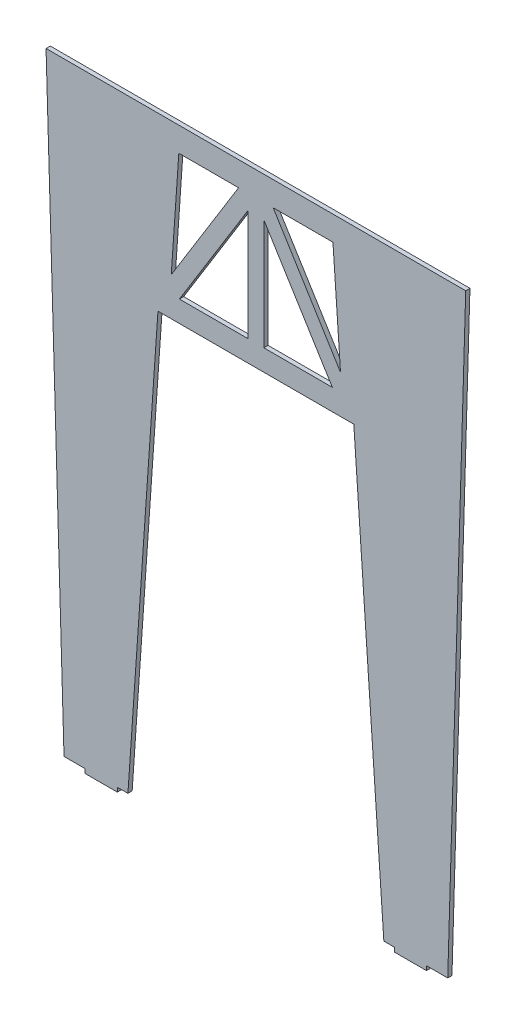
ISO-10303-21;
HEADER;
FILE_DESCRIPTION(('STEP AP214'),'2;1');
FILE_NAME('part.step','',(''),(''),'','','');
FILE_SCHEMA(('AUTOMOTIVE_DESIGN { 1 0 10303 214 1 1 1 1 }'));
ENDSEC;
DATA;
#1=APPLICATION_CONTEXT('core data for automotive mechanical design processes');
#2=APPLICATION_PROTOCOL_DEFINITION('international standard','automotive_design',2000,#1);
#3=PRODUCT_CONTEXT('',#1,'mechanical');
#4=PRODUCT('Part','Part','',(#3));
#5=PRODUCT_RELATED_PRODUCT_CATEGORY('part','',(#4));
#6=PRODUCT_DEFINITION_FORMATION('','',#4);
#7=PRODUCT_DEFINITION_CONTEXT('part definition',#1,'design');
#8=PRODUCT_DEFINITION('design','',#6,#7);
#9=PRODUCT_DEFINITION_SHAPE('','',#8);
#10=(LENGTH_UNIT() NAMED_UNIT(*) SI_UNIT(.MILLI.,.METRE.));
#11=(NAMED_UNIT(*) PLANE_ANGLE_UNIT() SI_UNIT($,.RADIAN.));
#12=(NAMED_UNIT(*) SI_UNIT($,.STERADIAN.) SOLID_ANGLE_UNIT());
#13=UNCERTAINTY_MEASURE_WITH_UNIT(LENGTH_MEASURE(1.E-05),#10,'distance_accuracy_value','');
#14=(GEOMETRIC_REPRESENTATION_CONTEXT(3) GLOBAL_UNCERTAINTY_ASSIGNED_CONTEXT((#13)) GLOBAL_UNIT_ASSIGNED_CONTEXT((#10,
#11,#12)) REPRESENTATION_CONTEXT('',''));
#15=CARTESIAN_POINT('',(0.,0.,0.));
#16=DIRECTION('',(0.,0.,1.));
#17=DIRECTION('',(1.,0.,0.));
#18=AXIS2_PLACEMENT_3D('',#15,#16,#17);
#19=CARTESIAN_POINT('',(626.751403761494,387.432839497839,10.16));
#20=DIRECTION('',(-0.850602753598735,-0.52580885839842,0.));
#21=DIRECTION('',(0.52580885839842,-0.850602753598735,0.));
#22=AXIS2_PLACEMENT_3D('',#19,#20,#21);
#23=PLANE('',#22);
#24=DIRECTION('',(-0.52580885839842,0.850602753598735,0.));
#25=VECTOR('',#24,1.);
#26=CARTESIAN_POINT('',(626.751403761494,387.432839497839,0.));
#27=LINE('',#26,#25);
#28=CARTESIAN_POINT('',(183.241684323222,1104.9,0.));
#29=VERTEX_POINT('',#28);
#30=CARTESIAN_POINT('',(19.05,1370.5134383676,0.));
#31=VERTEX_POINT('',#30);
#32=EDGE_CURVE('E230',#29,#31,#27,.T.);
#33=ORIENTED_EDGE('',*,*,#32,.F.);
#34=DIRECTION('',(0.,0.,-1.));
#35=VECTOR('',#34,1.);
#36=CARTESIAN_POINT('',(183.241684323222,1104.9,10.16));
#37=LINE('',#36,#35);
#38=CARTESIAN_POINT('',(183.241684323222,1104.9,10.16));
#39=VERTEX_POINT('',#38);
#40=EDGE_CURVE('E11',#39,#29,#37,.T.);
#41=ORIENTED_EDGE('',*,*,#40,.F.);
#42=DIRECTION('',(-0.52580885839842,0.850602753598735,0.));
#43=VECTOR('',#42,1.);
#44=CARTESIAN_POINT('',(626.751403761494,387.432839497839,10.16));
#45=LINE('',#44,#43);
#46=CARTESIAN_POINT('',(19.05,1370.5134383676,10.16));
#47=VERTEX_POINT('',#46);
#48=EDGE_CURVE('E228',#39,#47,#45,.T.);
#49=ORIENTED_EDGE('',*,*,#48,.T.);
#50=DIRECTION('',(0.,0.,-1.));
#51=VECTOR('',#50,1.);
#52=CARTESIAN_POINT('',(19.05,1370.5134383676,10.16));
#53=LINE('',#52,#51);
#54=EDGE_CURVE('E58',#47,#31,#53,.T.);
#55=ORIENTED_EDGE('',*,*,#54,.T.);
#56=EDGE_LOOP('',(#33,#41,#49,#55));
#57=FACE_BOUND('',#56,.T.);
#58=ADVANCED_FACE('F39',(#57),#23,.T.);
#59=CARTESIAN_POINT('',(7.88917784116219E-12,1104.9,10.16));
#60=DIRECTION('',(0.,1.,0.));
#61=DIRECTION('',(-1.,0.,0.));
#62=AXIS2_PLACEMENT_3D('',#59,#60,#61);
#63=PLANE('',#62);
#64=DIRECTION('',(1.,0.,0.));
#65=VECTOR('',#64,1.);
#66=CARTESIAN_POINT('',(7.88917784116219E-12,1104.9,0.));
#67=LINE('',#66,#65);
#68=CARTESIAN_POINT('',(19.0500000000007,1104.9,0.));
#69=VERTEX_POINT('',#68);
#70=EDGE_CURVE('E321',#69,#29,#67,.T.);
#71=ORIENTED_EDGE('',*,*,#70,.F.);
#72=DIRECTION('',(0.,0.,-1.));
#73=VECTOR('',#72,1.);
#74=CARTESIAN_POINT('',(19.0500000000007,1104.9,10.16));
#75=LINE('',#74,#73);
#76=CARTESIAN_POINT('',(19.0500000000007,1104.9,10.16));
#77=VERTEX_POINT('',#76);
#78=EDGE_CURVE('E49',#77,#69,#75,.T.);
#79=ORIENTED_EDGE('',*,*,#78,.F.);
#80=DIRECTION('',(1.,0.,0.));
#81=VECTOR('',#80,1.);
#82=CARTESIAN_POINT('',(7.88917784116219E-12,1104.9,10.16));
#83=LINE('',#82,#81);
#84=EDGE_CURVE('E237',#77,#39,#83,.T.);
#85=ORIENTED_EDGE('',*,*,#84,.T.);
#86=ORIENTED_EDGE('',*,*,#40,.T.);
#87=EDGE_LOOP('',(#71,#79,#85,#86));
#88=FACE_BOUND('',#87,.T.);
#89=ADVANCED_FACE('F241',(#88),#63,.T.);
#90=CARTESIAN_POINT('',(-306.363703468345,21.2790705516332,10.16));
#91=DIRECTION('',(0.997596562719211,-0.0692899563487692,0.));
#92=DIRECTION('',(0.0692899563487692,0.997596562719212,0.));
#93=AXIS2_PLACEMENT_3D('',#90,#91,#92);
#94=PLANE('',#93);
#95=DIRECTION('',(-0.0692899563487692,-0.997596562719211,0.));
#96=VECTOR('',#95,1.);
#97=CARTESIAN_POINT('',(-306.363703468345,21.2790705516332,0.));
#98=LINE('',#97,#96);
#99=CARTESIAN_POINT('',(-234.62717209688,1054.1,0.));
#100=VERTEX_POINT('',#99);
#101=CARTESIAN_POINT('',(-306.627827519024,17.4763658167283,0.));
#102=VERTEX_POINT('',#101);
#103=EDGE_CURVE('E272',#100,#102,#98,.T.);
#104=ORIENTED_EDGE('',*,*,#103,.F.);
#105=DIRECTION('',(0.,0.,-1.));
#106=VECTOR('',#105,1.);
#107=CARTESIAN_POINT('',(-234.62717209688,1054.1,10.16));
#108=LINE('',#107,#106);
#109=CARTESIAN_POINT('',(-234.62717209688,1054.1,10.16));
#110=VERTEX_POINT('',#109);
#111=EDGE_CURVE('E328',#110,#100,#108,.T.);
#112=ORIENTED_EDGE('',*,*,#111,.F.);
#113=DIRECTION('',(-0.0692899563487692,-0.997596562719211,0.));
#114=VECTOR('',#113,1.);
#115=CARTESIAN_POINT('',(-306.363703468345,21.2790705516332,10.16));
#116=LINE('',#115,#114);
#117=CARTESIAN_POINT('',(-306.627827519024,17.4763658167283,10.16));
#118=VERTEX_POINT('',#117);
#119=EDGE_CURVE('E415',#110,#118,#116,.T.);
#120=ORIENTED_EDGE('',*,*,#119,.T.);
#121=DIRECTION('',(0.,0.,-1.));
#122=VECTOR('',#121,1.);
#123=CARTESIAN_POINT('',(-306.627827519024,17.4763658167283,10.16));
#124=LINE('',#123,#122);
#125=EDGE_CURVE('E330',#118,#102,#124,.T.);
#126=ORIENTED_EDGE('',*,*,#125,.T.);
#127=EDGE_LOOP('',(#104,#112,#120,#126));
#128=FACE_BOUND('',#127,.T.);
#129=ADVANCED_FACE('F467',(#128),#94,.T.);
#130=CARTESIAN_POINT('',(-9.97570809721988E-13,1054.1,10.16));
#131=DIRECTION('',(0.,-1.,0.));
#132=DIRECTION('',(1.,0.,0.));
#133=AXIS2_PLACEMENT_3D('',#130,#131,#132);
#134=PLANE('',#133);
#135=DIRECTION('',(-1.,0.,0.));
#136=VECTOR('',#135,1.);
#137=CARTESIAN_POINT('',(-9.97570809721988E-13,1054.1,0.));
#138=LINE('',#137,#136);
#139=CARTESIAN_POINT('',(234.627172096901,1054.1,0.));
#140=VERTEX_POINT('',#139);
#141=EDGE_CURVE('E275',#140,#100,#138,.T.);
#142=ORIENTED_EDGE('',*,*,#141,.F.);
#143=DIRECTION('',(0.,0.,-1.));
#144=VECTOR('',#143,1.);
#145=CARTESIAN_POINT('',(234.627172096901,1054.1,10.16));
#146=LINE('',#145,#144);
#147=CARTESIAN_POINT('',(234.627172096901,1054.1,10.16));
#148=VERTEX_POINT('',#147);
#149=EDGE_CURVE('E361',#148,#140,#146,.T.);
#150=ORIENTED_EDGE('',*,*,#149,.F.);
#151=DIRECTION('',(-1.,0.,0.));
#152=VECTOR('',#151,1.);
#153=CARTESIAN_POINT('',(-9.97570809721988E-13,1054.1,10.16));
#154=LINE('',#153,#152);
#155=EDGE_CURVE('E418',#148,#110,#154,.T.);
#156=ORIENTED_EDGE('',*,*,#155,.T.);
#157=ORIENTED_EDGE('',*,*,#111,.T.);
#158=EDGE_LOOP('',(#142,#150,#156,#157));
#159=FACE_BOUND('',#158,.T.);
#160=ADVANCED_FACE('F470',(#159),#134,.T.);
#161=CARTESIAN_POINT('',(306.363703468387,21.2790705516425,10.16));
#162=DIRECTION('',(-0.99759656271921,-0.0692899563487899,0.));
#163=DIRECTION('',(0.0692899563487899,-0.99759656271921,0.));
#164=AXIS2_PLACEMENT_3D('',#161,#162,#163);
#165=PLANE('',#164);
#166=DIRECTION('',(-0.0692899563487899,0.99759656271921,0.));
#167=VECTOR('',#166,1.);
#168=CARTESIAN_POINT('',(306.363703468387,21.2790705516425,0.));
#169=LINE('',#168,#167);
#170=CARTESIAN_POINT('',(306.627827519066,17.476365816735,0.));
#171=VERTEX_POINT('',#170);
#172=EDGE_CURVE('E278',#171,#140,#169,.T.);
#173=ORIENTED_EDGE('',*,*,#172,.F.);
#174=DIRECTION('',(0.,0.,-1.));
#175=VECTOR('',#174,1.);
#176=CARTESIAN_POINT('',(306.627827519066,17.476365816735,10.16));
#177=LINE('',#176,#175);
#178=CARTESIAN_POINT('',(306.627827519066,17.476365816735,10.16));
#179=VERTEX_POINT('',#178);
#180=EDGE_CURVE('E359',#179,#171,#177,.T.);
#181=ORIENTED_EDGE('',*,*,#180,.F.);
#182=DIRECTION('',(-0.0692899563487899,0.99759656271921,0.));
#183=VECTOR('',#182,1.);
#184=CARTESIAN_POINT('',(306.363703468387,21.2790705516425,10.16));
#185=LINE('',#184,#183);
#186=EDGE_CURVE('E421',#179,#148,#185,.T.);
#187=ORIENTED_EDGE('',*,*,#186,.T.);
#188=ORIENTED_EDGE('',*,*,#149,.T.);
#189=EDGE_LOOP('',(#173,#181,#187,#188));
#190=FACE_BOUND('',#189,.T.);
#191=ADVANCED_FACE('F475',(#190),#165,.T.);
#192=CARTESIAN_POINT('',(2.67684877527776E-12,17.4763658167819,10.16));
#193=DIRECTION('',(-1.5316964655817E-13,-1.,0.));
#194=DIRECTION('',(1.,-1.5316964655817E-13,0.));
#195=AXIS2_PLACEMENT_3D('',#192,#193,#194);
#196=PLANE('',#195);
#197=DIRECTION('',(-1.,1.5316964655817E-13,0.));
#198=VECTOR('',#197,1.);
#199=CARTESIAN_POINT('',(2.67684877527776E-12,17.4763658167819,0.));
#200=LINE('',#199,#198);
#201=CARTESIAN_POINT('',(332.721789204436,17.476365816731,0.));
#202=VERTEX_POINT('',#201);
#203=EDGE_CURVE('E281',#202,#171,#200,.T.);
#204=ORIENTED_EDGE('',*,*,#203,.F.);
#205=DIRECTION('',(0.,0.,-1.));
#206=VECTOR('',#205,1.);
#207=CARTESIAN_POINT('',(332.721789204436,17.476365816731,10.16));
#208=LINE('',#207,#206);
#209=CARTESIAN_POINT('',(332.721789204436,17.476365816731,10.16));
#210=VERTEX_POINT('',#209);
#211=EDGE_CURVE('E357',#210,#202,#208,.T.);
#212=ORIENTED_EDGE('',*,*,#211,.F.);
#213=DIRECTION('',(-1.,1.5316964655817E-13,0.));
#214=VECTOR('',#213,1.);
#215=CARTESIAN_POINT('',(2.67684877527776E-12,17.4763658167819,10.16));
#216=LINE('',#215,#214);
#217=EDGE_CURVE('E424',#210,#179,#216,.T.);
#218=ORIENTED_EDGE('',*,*,#217,.T.);
#219=ORIENTED_EDGE('',*,*,#180,.T.);
#220=EDGE_LOOP('',(#204,#212,#218,#219));
#221=FACE_BOUND('',#220,.T.);
#222=ADVANCED_FACE('F478',(#221),#196,.T.);
#223=CARTESIAN_POINT('',(332.721789204437,5.45367211371917E-12,10.16));
#224=DIRECTION('',(1.,0.,0.));
#225=DIRECTION('',(0.,1.,0.));
#226=AXIS2_PLACEMENT_3D('',#223,#224,#225);
#227=PLANE('',#226);
#228=DIRECTION('',(0.,-1.,0.));
#229=VECTOR('',#228,1.);
#230=CARTESIAN_POINT('',(332.721789204437,5.45367211371917E-12,0.));
#231=LINE('',#230,#229);
#232=CARTESIAN_POINT('',(332.721789204437,7.31636581673101,0.));
#233=VERTEX_POINT('',#232);
#234=EDGE_CURVE('E284',#202,#233,#231,.T.);
#235=ORIENTED_EDGE('',*,*,#234,.T.);
#236=DIRECTION('',(0.,0.,-1.));
#237=VECTOR('',#236,1.);
#238=CARTESIAN_POINT('',(332.721789204437,7.31636581673101,10.16));
#239=LINE('',#238,#237);
#240=CARTESIAN_POINT('',(332.721789204437,7.31636581673101,10.16));
#241=VERTEX_POINT('',#240);
#242=EDGE_CURVE('E355',#241,#233,#239,.T.);
#243=ORIENTED_EDGE('',*,*,#242,.F.);
#244=DIRECTION('',(0.,-1.,0.));
#245=VECTOR('',#244,1.);
#246=CARTESIAN_POINT('',(332.721789204437,5.45367211371917E-12,10.16));
#247=LINE('',#246,#245);
#248=EDGE_CURVE('E427',#210,#241,#247,.T.);
#249=ORIENTED_EDGE('',*,*,#248,.F.);
#250=ORIENTED_EDGE('',*,*,#211,.T.);
#251=EDGE_LOOP('',(#235,#243,#249,#250));
#252=FACE_BOUND('',#251,.T.);
#253=ADVANCED_FACE('F484',(#252),#227,.F.);
#254=CARTESIAN_POINT('',(0.,7.31636581672713,10.16));
#255=DIRECTION('',(0.,-1.,0.));
#256=DIRECTION('',(1.,0.,0.));
#257=AXIS2_PLACEMENT_3D('',#254,#255,#256);
#258=PLANE('',#257);
#259=DIRECTION('',(-1.,0.,0.));
#260=VECTOR('',#259,1.);
#261=CARTESIAN_POINT('',(0.,7.31636581672713,0.));
#262=LINE('',#261,#260);
#263=CARTESIAN_POINT('',(408.921789204437,7.3163658167319,0.));
#264=VERTEX_POINT('',#263);
#265=EDGE_CURVE('E287',#264,#233,#262,.T.);
#266=ORIENTED_EDGE('',*,*,#265,.F.);
#267=DIRECTION('',(0.,0.,-1.));
#268=VECTOR('',#267,1.);
#269=CARTESIAN_POINT('',(408.921789204437,7.3163658167319,10.16));
#270=LINE('',#269,#268);
#271=CARTESIAN_POINT('',(408.921789204437,7.3163658167319,10.16));
#272=VERTEX_POINT('',#271);
#273=EDGE_CURVE('E353',#272,#264,#270,.T.);
#274=ORIENTED_EDGE('',*,*,#273,.F.);
#275=DIRECTION('',(-1.,0.,0.));
#276=VECTOR('',#275,1.);
#277=CARTESIAN_POINT('',(0.,7.31636581672713,10.16));
#278=LINE('',#277,#276);
#279=EDGE_CURVE('E429',#272,#241,#278,.T.);
#280=ORIENTED_EDGE('',*,*,#279,.T.);
#281=ORIENTED_EDGE('',*,*,#242,.T.);
#282=EDGE_LOOP('',(#266,#274,#280,#281));
#283=FACE_BOUND('',#282,.T.);
#284=ADVANCED_FACE('F488',(#283),#258,.T.);
#285=CARTESIAN_POINT('',(408.921789204437,6.70267301642248E-12,10.16));
#286=DIRECTION('',(1.,0.,0.));
#287=DIRECTION('',(0.,1.,0.));
#288=AXIS2_PLACEMENT_3D('',#285,#286,#287);
#289=PLANE('',#288);
#290=DIRECTION('',(0.,-1.,0.));
#291=VECTOR('',#290,1.);
#292=CARTESIAN_POINT('',(408.921789204437,6.70267301642248E-12,0.));
#293=LINE('',#292,#291);
#294=CARTESIAN_POINT('',(408.921789204436,17.4763658167318,0.));
#295=VERTEX_POINT('',#294);
#296=EDGE_CURVE('E290',#295,#264,#293,.T.);
#297=ORIENTED_EDGE('',*,*,#296,.F.);
#298=DIRECTION('',(0.,0.,-1.));
#299=VECTOR('',#298,1.);
#300=CARTESIAN_POINT('',(408.921789204436,17.4763658167318,10.16));
#301=LINE('',#300,#299);
#302=CARTESIAN_POINT('',(408.921789204436,17.4763658167318,10.16));
#303=VERTEX_POINT('',#302);
#304=EDGE_CURVE('E351',#303,#295,#301,.T.);
#305=ORIENTED_EDGE('',*,*,#304,.F.);
#306=DIRECTION('',(0.,-1.,0.));
#307=VECTOR('',#306,1.);
#308=CARTESIAN_POINT('',(408.921789204437,6.70267301642248E-12,10.16));
#309=LINE('',#308,#307);
#310=EDGE_CURVE('E432',#303,#272,#309,.T.);
#311=ORIENTED_EDGE('',*,*,#310,.T.);
#312=ORIENTED_EDGE('',*,*,#273,.T.);
#313=EDGE_LOOP('',(#297,#305,#311,#312));
#314=FACE_BOUND('',#313,.T.);
#315=ADVANCED_FACE('F491',(#314),#289,.T.);
#316=CARTESIAN_POINT('',(-3.05553759314949E-13,17.4763658167247,10.16));
#317=DIRECTION('',(0.,-1.,0.));
#318=DIRECTION('',(1.,0.,0.));
#319=AXIS2_PLACEMENT_3D('',#316,#317,#318);
#320=PLANE('',#319);
#321=DIRECTION('',(-1.,0.,0.));
#322=VECTOR('',#321,1.);
#323=CARTESIAN_POINT('',(-3.05553759314949E-13,17.4763658167247,0.));
#324=LINE('',#323,#322);
#325=CARTESIAN_POINT('',(459.721789204438,17.4763658167327,0.));
#326=VERTEX_POINT('',#325);
#327=EDGE_CURVE('E293',#326,#295,#324,.T.);
#328=ORIENTED_EDGE('',*,*,#327,.F.);
#329=DIRECTION('',(0.,0.,-1.));
#330=VECTOR('',#329,1.);
#331=CARTESIAN_POINT('',(459.721789204438,17.4763658167327,10.16));
#332=LINE('',#331,#330);
#333=CARTESIAN_POINT('',(459.721789204438,17.4763658167327,10.16));
#334=VERTEX_POINT('',#333);
#335=EDGE_CURVE('E349',#334,#326,#332,.T.);
#336=ORIENTED_EDGE('',*,*,#335,.F.);
#337=DIRECTION('',(-1.,0.,0.));
#338=VECTOR('',#337,1.);
#339=CARTESIAN_POINT('',(-3.05553759314949E-13,17.4763658167247,10.16));
#340=LINE('',#339,#338);
#341=EDGE_CURVE('E435',#334,#303,#340,.T.);
#342=ORIENTED_EDGE('',*,*,#341,.T.);
#343=ORIENTED_EDGE('',*,*,#304,.T.);
#344=EDGE_LOOP('',(#328,#336,#342,#343));
#345=FACE_BOUND('',#344,.T.);
#346=ADVANCED_FACE('F495',(#345),#320,.T.);
#347=CARTESIAN_POINT('',(458.796027329948,-13.6468949518883,10.16));
#348=DIRECTION('',(-0.999557910363731,0.0297318655535194,0.));
#349=DIRECTION('',(-0.0297318655535194,-0.999557910363731,0.));
#350=AXIS2_PLACEMENT_3D('',#347,#348,#349);
#351=PLANE('',#350);
#352=DIRECTION('',(0.0297318655535194,0.999557910363731,0.));
#353=VECTOR('',#352,1.);
#354=CARTESIAN_POINT('',(458.796027329948,-13.6468949518883,0.));
#355=LINE('',#354,#353);
#356=CARTESIAN_POINT('',(502.783260532715,1465.16333388139,0.));
#357=VERTEX_POINT('',#356);
#358=EDGE_CURVE('E296',#326,#357,#355,.T.);
#359=ORIENTED_EDGE('',*,*,#358,.T.);
#360=DIRECTION('',(0.,0.,-1.));
#361=VECTOR('',#360,1.);
#362=CARTESIAN_POINT('',(502.783260532715,1465.16333388139,10.16));
#363=LINE('',#362,#361);
#364=CARTESIAN_POINT('',(502.783260532715,1465.16333388139,10.16));
#365=VERTEX_POINT('',#364);
#366=EDGE_CURVE('E346',#365,#357,#363,.T.);
#367=ORIENTED_EDGE('',*,*,#366,.F.);
#368=DIRECTION('',(0.0297318655535194,0.999557910363731,0.));
#369=VECTOR('',#368,1.);
#370=CARTESIAN_POINT('',(458.796027329948,-13.6468949518883,10.16));
#371=LINE('',#370,#369);
#372=EDGE_CURVE('E438',#334,#365,#371,.T.);
#373=ORIENTED_EDGE('',*,*,#372,.F.);
#374=ORIENTED_EDGE('',*,*,#335,.T.);
#375=EDGE_LOOP('',(#359,#367,#373,#374));
#376=FACE_BOUND('',#375,.T.);
#377=ADVANCED_FACE('F500',(#376),#351,.F.);
#378=CARTESIAN_POINT('',(0.,1465.16333388139,10.16));
#379=DIRECTION('',(0.,-1.,0.));
#380=DIRECTION('',(0.,0.,-1.));
#381=AXIS2_PLACEMENT_3D('',#378,#379,#380);
#382=PLANE('',#381);
#383=DIRECTION('',(-1.,0.,0.));
#384=VECTOR('',#383,1.);
#385=CARTESIAN_POINT('',(0.,1465.16333388139,0.));
#386=LINE('',#385,#384);
#387=CARTESIAN_POINT('',(-502.783260532698,1465.16333388139,0.));
#388=VERTEX_POINT('',#387);
#389=EDGE_CURVE('E299',#357,#388,#386,.T.);
#390=ORIENTED_EDGE('',*,*,#389,.T.);
#391=DIRECTION('',(0.,0.,-1.));
#392=VECTOR('',#391,1.);
#393=CARTESIAN_POINT('',(-502.783260532698,1465.16333388139,10.16));
#394=LINE('',#393,#392);
#395=CARTESIAN_POINT('',(-502.783260532698,1465.16333388139,10.16));
#396=VERTEX_POINT('',#395);
#397=EDGE_CURVE('E344',#396,#388,#394,.T.);
#398=ORIENTED_EDGE('',*,*,#397,.F.);
#399=DIRECTION('',(-1.,0.,0.));
#400=VECTOR('',#399,1.);
#401=CARTESIAN_POINT('',(0.,1465.16333388139,10.16));
#402=LINE('',#401,#400);
#403=EDGE_CURVE('E441',#365,#396,#402,.T.);
#404=ORIENTED_EDGE('',*,*,#403,.F.);
#405=ORIENTED_EDGE('',*,*,#366,.T.);
#406=EDGE_LOOP('',(#390,#398,#404,#405));
#407=FACE_BOUND('',#406,.T.);
#408=ADVANCED_FACE('F505',(#407),#382,.F.);
#409=CARTESIAN_POINT('',(-458.796027329871,-13.6468949519044,10.16));
#410=DIRECTION('',(-0.999557910363729,-0.0297318655535594,0.));
#411=DIRECTION('',(0.0297318655535594,-0.999557910363729,0.));
#412=AXIS2_PLACEMENT_3D('',#409,#410,#411);
#413=PLANE('',#412);
#414=DIRECTION('',(-0.0297318655535594,0.999557910363729,0.));
#415=VECTOR('',#414,1.);
#416=CARTESIAN_POINT('',(-458.796027329871,-13.6468949519044,0.));
#417=LINE('',#416,#415);
#418=CARTESIAN_POINT('',(-459.721789204362,17.4763658167194,0.));
#419=VERTEX_POINT('',#418);
#420=EDGE_CURVE('E302',#419,#388,#417,.T.);
#421=ORIENTED_EDGE('',*,*,#420,.F.);
#422=DIRECTION('',(0.,0.,-1.));
#423=VECTOR('',#422,1.);
#424=CARTESIAN_POINT('',(-459.721789204362,17.4763658167194,10.16));
#425=LINE('',#424,#423);
#426=CARTESIAN_POINT('',(-459.721789204362,17.4763658167194,10.16));
#427=VERTEX_POINT('',#426);
#428=EDGE_CURVE('E342',#427,#419,#425,.T.);
#429=ORIENTED_EDGE('',*,*,#428,.F.);
#430=DIRECTION('',(-0.0297318655535594,0.999557910363729,0.));
#431=VECTOR('',#430,1.);
#432=CARTESIAN_POINT('',(-458.796027329871,-13.6468949519044,10.16));
#433=LINE('',#432,#431);
#434=EDGE_CURVE('E443',#427,#396,#433,.T.);
#435=ORIENTED_EDGE('',*,*,#434,.T.);
#436=ORIENTED_EDGE('',*,*,#397,.T.);
#437=EDGE_LOOP('',(#421,#429,#435,#436));
#438=FACE_BOUND('',#437,.T.);
#439=ADVANCED_FACE('F508',(#438),#413,.T.);
#440=CARTESIAN_POINT('',(-3.05553759315014E-13,17.4763658167274,10.16));
#441=DIRECTION('',(0.,-1.,0.));
#442=DIRECTION('',(1.,0.,0.));
#443=AXIS2_PLACEMENT_3D('',#440,#441,#442);
#444=PLANE('',#443);
#445=DIRECTION('',(-1.,0.,0.));
#446=VECTOR('',#445,1.);
#447=CARTESIAN_POINT('',(-3.05553759315014E-13,17.4763658167274,0.));
#448=LINE('',#447,#446);
#449=CARTESIAN_POINT('',(-408.921789204363,17.4763658167203,0.));
#450=VERTEX_POINT('',#449);
#451=EDGE_CURVE('E305',#450,#419,#448,.T.);
#452=ORIENTED_EDGE('',*,*,#451,.F.);
#453=DIRECTION('',(0.,0.,-1.));
#454=VECTOR('',#453,1.);
#455=CARTESIAN_POINT('',(-408.921789204363,17.4763658167203,10.16));
#456=LINE('',#455,#454);
#457=CARTESIAN_POINT('',(-408.921789204363,17.4763658167203,10.16));
#458=VERTEX_POINT('',#457);
#459=EDGE_CURVE('E340',#458,#450,#456,.T.);
#460=ORIENTED_EDGE('',*,*,#459,.F.);
#461=DIRECTION('',(-1.,0.,0.));
#462=VECTOR('',#461,1.);
#463=CARTESIAN_POINT('',(-3.05553759315014E-13,17.4763658167274,10.16));
#464=LINE('',#463,#462);
#465=EDGE_CURVE('E446',#458,#427,#464,.T.);
#466=ORIENTED_EDGE('',*,*,#465,.T.);
#467=ORIENTED_EDGE('',*,*,#428,.T.);
#468=EDGE_LOOP('',(#452,#460,#466,#467));
#469=FACE_BOUND('',#468,.T.);
#470=ADVANCED_FACE('F511',(#469),#444,.T.);
#471=CARTESIAN_POINT('',(-408.921789204363,-6.70267301642128E-12,10.16));
#472=DIRECTION('',(1.,0.,0.));
#473=DIRECTION('',(0.,1.,0.));
#474=AXIS2_PLACEMENT_3D('',#471,#472,#473);
#475=PLANE('',#474);
#476=DIRECTION('',(0.,-1.,0.));
#477=VECTOR('',#476,1.);
#478=CARTESIAN_POINT('',(-408.921789204363,-6.70267301642128E-12,0.));
#479=LINE('',#478,#477);
#480=CARTESIAN_POINT('',(-408.921789204363,7.31636581672035,0.));
#481=VERTEX_POINT('',#480);
#482=EDGE_CURVE('E308',#450,#481,#479,.T.);
#483=ORIENTED_EDGE('',*,*,#482,.T.);
#484=DIRECTION('',(0.,0.,-1.));
#485=VECTOR('',#484,1.);
#486=CARTESIAN_POINT('',(-408.921789204363,7.31636581672035,10.16));
#487=LINE('',#486,#485);
#488=CARTESIAN_POINT('',(-408.921789204363,7.31636581672035,10.16));
#489=VERTEX_POINT('',#488);
#490=EDGE_CURVE('E337',#489,#481,#487,.T.);
#491=ORIENTED_EDGE('',*,*,#490,.F.);
#492=DIRECTION('',(0.,-1.,0.));
#493=VECTOR('',#492,1.);
#494=CARTESIAN_POINT('',(-408.921789204363,-6.70267301642128E-12,10.16));
#495=LINE('',#494,#493);
#496=EDGE_CURVE('E449',#458,#489,#495,.T.);
#497=ORIENTED_EDGE('',*,*,#496,.F.);
#498=ORIENTED_EDGE('',*,*,#459,.T.);
#499=EDGE_LOOP('',(#483,#491,#497,#498));
#500=FACE_BOUND('',#499,.T.);
#501=ADVANCED_FACE('F516',(#500),#475,.F.);
#502=CARTESIAN_POINT('',(0.,7.31636581672508,10.16));
#503=DIRECTION('',(0.,1.,0.));
#504=DIRECTION('',(-1.,0.,0.));
#505=AXIS2_PLACEMENT_3D('',#502,#503,#504);
#506=PLANE('',#505);
#507=DIRECTION('',(1.,0.,0.));
#508=VECTOR('',#507,1.);
#509=CARTESIAN_POINT('',(0.,7.31636581672508,0.));
#510=LINE('',#509,#508);
#511=CARTESIAN_POINT('',(-332.100796745169,7.31636581672124,0.));
#512=VERTEX_POINT('',#511);
#513=EDGE_CURVE('E311',#481,#512,#510,.T.);
#514=ORIENTED_EDGE('',*,*,#513,.T.);
#515=DIRECTION('',(0.,0.,-1.));
#516=VECTOR('',#515,1.);
#517=CARTESIAN_POINT('',(-332.100796745169,7.31636581672124,10.16));
#518=LINE('',#517,#516);
#519=CARTESIAN_POINT('',(-332.100796745169,7.31636581672124,10.16));
#520=VERTEX_POINT('',#519);
#521=EDGE_CURVE('E335',#520,#512,#518,.T.);
#522=ORIENTED_EDGE('',*,*,#521,.F.);
#523=DIRECTION('',(1.,0.,0.));
#524=VECTOR('',#523,1.);
#525=CARTESIAN_POINT('',(0.,7.31636581672508,10.16));
#526=LINE('',#525,#524);
#527=EDGE_CURVE('E452',#489,#520,#526,.T.);
#528=ORIENTED_EDGE('',*,*,#527,.F.);
#529=ORIENTED_EDGE('',*,*,#490,.T.);
#530=EDGE_LOOP('',(#514,#522,#528,#529));
#531=FACE_BOUND('',#530,.T.);
#532=ADVANCED_FACE('F519',(#531),#506,.F.);
#533=CARTESIAN_POINT('',(-332.100796745169,-5.44349337169559E-12,10.16));
#534=DIRECTION('',(1.,0.,0.));
#535=DIRECTION('',(0.,1.,0.));
#536=AXIS2_PLACEMENT_3D('',#533,#534,#535);
#537=PLANE('',#536);
#538=DIRECTION('',(0.,-1.,0.));
#539=VECTOR('',#538,1.);
#540=CARTESIAN_POINT('',(-332.100796745169,-5.44349337169559E-12,0.));
#541=LINE('',#540,#539);
#542=CARTESIAN_POINT('',(-332.100796745169,17.4763658167212,0.));
#543=VERTEX_POINT('',#542);
#544=EDGE_CURVE('E314',#543,#512,#541,.T.);
#545=ORIENTED_EDGE('',*,*,#544,.F.);
#546=DIRECTION('',(0.,0.,-1.));
#547=VECTOR('',#546,1.);
#548=CARTESIAN_POINT('',(-332.100796745169,17.4763658167212,10.16));
#549=LINE('',#548,#547);
#550=CARTESIAN_POINT('',(-332.100796745169,17.4763658167212,10.16));
#551=VERTEX_POINT('',#550);
#552=EDGE_CURVE('E332',#551,#543,#549,.T.);
#553=ORIENTED_EDGE('',*,*,#552,.F.);
#554=DIRECTION('',(0.,-1.,0.));
#555=VECTOR('',#554,1.);
#556=CARTESIAN_POINT('',(-332.100796745169,-5.44349337169559E-12,10.16));
#557=LINE('',#556,#555);
#558=EDGE_CURVE('E454',#551,#520,#557,.T.);
#559=ORIENTED_EDGE('',*,*,#558,.T.);
#560=ORIENTED_EDGE('',*,*,#521,.T.);
#561=EDGE_LOOP('',(#545,#553,#559,#560));
#562=FACE_BOUND('',#561,.T.);
#563=ADVANCED_FACE('F522',(#562),#537,.T.);
#564=CARTESIAN_POINT('',(-659.159368673606,407.466157002818,10.16));
#565=DIRECTION('',(-0.850602753598735,0.525808858398419,0.));
#566=DIRECTION('',(-0.52580885839842,-0.850602753598735,0.));
#567=AXIS2_PLACEMENT_3D('',#564,#565,#566);
#568=PLANE('',#567);
#569=DIRECTION('',(0.52580885839842,0.850602753598735,0.));
#570=VECTOR('',#569,1.);
#571=CARTESIAN_POINT('',(-659.159368673606,407.466157002818,0.));
#572=LINE('',#571,#570);
#573=CARTESIAN_POINT('',(-202.802614529815,1145.71600863228,0.));
#574=VERTEX_POINT('',#573);
#575=CARTESIAN_POINT('',(-41.4458832949963,1406.74333388139,0.));
#576=VERTEX_POINT('',#575);
#577=EDGE_CURVE('E263',#574,#576,#572,.T.);
#578=ORIENTED_EDGE('',*,*,#577,.F.);
#579=DIRECTION('',(0.,0.,-1.));
#580=VECTOR('',#579,1.);
#581=CARTESIAN_POINT('',(-202.802614529815,1145.71600863228,10.16));
#582=LINE('',#581,#580);
#583=CARTESIAN_POINT('',(-202.802614529815,1145.71600863228,10.16));
#584=VERTEX_POINT('',#583);
#585=EDGE_CURVE('E333',#584,#574,#582,.T.);
#586=ORIENTED_EDGE('',*,*,#585,.F.);
#587=DIRECTION('',(0.52580885839842,0.850602753598735,0.));
#588=VECTOR('',#587,1.);
#589=CARTESIAN_POINT('',(-659.159368673606,407.466157002818,10.16));
#590=LINE('',#589,#588);
#591=CARTESIAN_POINT('',(-41.4458832949963,1406.74333388139,10.16));
#592=VERTEX_POINT('',#591);
#593=EDGE_CURVE('E407',#584,#592,#590,.T.);
#594=ORIENTED_EDGE('',*,*,#593,.T.);
#595=DIRECTION('',(0.,0.,-1.));
#596=VECTOR('',#595,1.);
#597=CARTESIAN_POINT('',(-41.4458832949963,1406.74333388139,10.16));
#598=LINE('',#597,#596);
#599=EDGE_CURVE('E364',#592,#576,#598,.T.);
#600=ORIENTED_EDGE('',*,*,#599,.T.);
#601=EDGE_LOOP('',(#578,#586,#594,#600));
#602=FACE_BOUND('',#601,.T.);
#603=ADVANCED_FACE('F549',(#602),#568,.T.);
#604=CARTESIAN_POINT('',(-281.024750775292,19.5191056603753,10.16));
#605=DIRECTION('',(-0.997596562719211,0.0692899563487683,0.));
#606=DIRECTION('',(-0.0692899563487683,-0.997596562719212,0.));
#607=AXIS2_PLACEMENT_3D('',#604,#605,#606);
#608=PLANE('',#607);
#609=DIRECTION('',(0.0692899563487683,0.997596562719212,0.));
#610=VECTOR('',#609,1.);
#611=CARTESIAN_POINT('',(-281.024750775292,19.5191056603753,0.));
#612=LINE('',#611,#610);
#613=CARTESIAN_POINT('',(-184.672467887122,1406.74333388139,0.));
#614=VERTEX_POINT('',#613);
#615=EDGE_CURVE('E266',#574,#614,#612,.T.);
#616=ORIENTED_EDGE('',*,*,#615,.T.);
#617=DIRECTION('',(0.,0.,-1.));
#618=VECTOR('',#617,1.);
#619=CARTESIAN_POINT('',(-184.672467887122,1406.74333388139,10.16));
#620=LINE('',#619,#618);
#621=CARTESIAN_POINT('',(-184.672467887122,1406.74333388139,10.16));
#622=VERTEX_POINT('',#621);
#623=EDGE_CURVE('E366',#622,#614,#620,.T.);
#624=ORIENTED_EDGE('',*,*,#623,.F.);
#625=DIRECTION('',(0.0692899563487683,0.997596562719212,0.));
#626=VECTOR('',#625,1.);
#627=CARTESIAN_POINT('',(-281.024750775292,19.5191056603753,10.16));
#628=LINE('',#627,#626);
#629=EDGE_CURVE('E410',#584,#622,#628,.T.);
#630=ORIENTED_EDGE('',*,*,#629,.F.);
#631=ORIENTED_EDGE('',*,*,#585,.T.);
#632=EDGE_LOOP('',(#616,#624,#630,#631));
#633=FACE_BOUND('',#632,.T.);
#634=ADVANCED_FACE('F581',(#633),#608,.F.);
#635=CARTESIAN_POINT('',(-626.751403761494,387.432839497839,10.16));
#636=DIRECTION('',(-0.850602753598735,0.52580885839842,0.));
#637=DIRECTION('',(-0.52580885839842,-0.850602753598735,0.));
#638=AXIS2_PLACEMENT_3D('',#635,#636,#637);
#639=PLANE('',#638);
#640=DIRECTION('',(0.52580885839842,0.850602753598735,0.));
#641=VECTOR('',#640,1.);
#642=CARTESIAN_POINT('',(-626.751403761494,387.432839497839,0.));
#643=LINE('',#642,#641);
#644=CARTESIAN_POINT('',(-183.241684323223,1104.9,0.));
#645=VERTEX_POINT('',#644);
#646=CARTESIAN_POINT('',(-19.05,1370.5134383676,0.));
#647=VERTEX_POINT('',#646);
#648=EDGE_CURVE('E256',#645,#647,#643,.T.);
#649=ORIENTED_EDGE('',*,*,#648,.T.);
#650=DIRECTION('',(0.,0.,-1.));
#651=VECTOR('',#650,1.);
#652=CARTESIAN_POINT('',(-19.05,1370.5134383676,10.16));
#653=LINE('',#652,#651);
#654=CARTESIAN_POINT('',(-19.05,1370.5134383676,10.16));
#655=VERTEX_POINT('',#654);
#656=EDGE_CURVE('E367',#655,#647,#653,.T.);
#657=ORIENTED_EDGE('',*,*,#656,.F.);
#658=DIRECTION('',(0.52580885839842,0.850602753598735,0.));
#659=VECTOR('',#658,1.);
#660=CARTESIAN_POINT('',(-626.751403761494,387.432839497839,10.16));
#661=LINE('',#660,#659);
#662=CARTESIAN_POINT('',(-183.241684323223,1104.9,10.16));
#663=VERTEX_POINT('',#662);
#664=EDGE_CURVE('E396',#663,#655,#661,.T.);
#665=ORIENTED_EDGE('',*,*,#664,.F.);
#666=DIRECTION('',(0.,0.,-1.));
#667=VECTOR('',#666,1.);
#668=CARTESIAN_POINT('',(-183.241684323223,1104.9,10.16));
#669=LINE('',#668,#667);
#670=EDGE_CURVE('E371',#663,#645,#669,.T.);
#671=ORIENTED_EDGE('',*,*,#670,.T.);
#672=EDGE_LOOP('',(#649,#657,#665,#671));
#673=FACE_BOUND('',#672,.T.);
#674=ADVANCED_FACE('F584',(#673),#639,.F.);
#675=CARTESIAN_POINT('',(-19.0500000000038,0.,10.16));
#676=DIRECTION('',(1.,0.,0.));
#677=DIRECTION('',(0.,1.,0.));
#678=AXIS2_PLACEMENT_3D('',#675,#676,#677);
#679=PLANE('',#678);
#680=DIRECTION('',(0.,-1.,0.));
#681=VECTOR('',#680,1.);
#682=CARTESIAN_POINT('',(-19.0500000000038,0.,0.));
#683=LINE('',#682,#681);
#684=CARTESIAN_POINT('',(-19.0500000000007,1104.9,0.));
#685=VERTEX_POINT('',#684);
#686=EDGE_CURVE('E259',#647,#685,#683,.T.);
#687=ORIENTED_EDGE('',*,*,#686,.T.);
#688=DIRECTION('',(0.,0.,-1.));
#689=VECTOR('',#688,1.);
#690=CARTESIAN_POINT('',(-19.0500000000007,1104.9,10.16));
#691=LINE('',#690,#689);
#692=CARTESIAN_POINT('',(-19.0500000000007,1104.9,10.16));
#693=VERTEX_POINT('',#692);
#694=EDGE_CURVE('E374',#693,#685,#691,.T.);
#695=ORIENTED_EDGE('',*,*,#694,.F.);
#696=DIRECTION('',(0.,-1.,0.));
#697=VECTOR('',#696,1.);
#698=CARTESIAN_POINT('',(-19.0500000000038,0.,10.16));
#699=LINE('',#698,#697);
#700=EDGE_CURVE('E399',#655,#693,#699,.T.);
#701=ORIENTED_EDGE('',*,*,#700,.F.);
#702=ORIENTED_EDGE('',*,*,#656,.T.);
#703=EDGE_LOOP('',(#687,#695,#701,#702));
#704=FACE_BOUND('',#703,.T.);
#705=ADVANCED_FACE('F592',(#704),#679,.F.);
#706=CARTESIAN_POINT('',(281.024750775292,19.5191056603753,10.16));
#707=DIRECTION('',(-0.997596562719211,-0.0692899563487683,0.));
#708=DIRECTION('',(0.0692899563487683,-0.997596562719212,0.));
#709=AXIS2_PLACEMENT_3D('',#706,#707,#708);
#710=PLANE('',#709);
#711=DIRECTION('',(-0.0692899563487683,0.997596562719212,0.));
#712=VECTOR('',#711,1.);
#713=CARTESIAN_POINT('',(281.024750775292,19.5191056603753,0.));
#714=LINE('',#713,#712);
#715=CARTESIAN_POINT('',(202.802614529815,1145.71600863228,0.));
#716=VERTEX_POINT('',#715);
#717=CARTESIAN_POINT('',(184.672467887122,1406.74333388139,0.));
#718=VERTEX_POINT('',#717);
#719=EDGE_CURVE('E247',#716,#718,#714,.T.);
#720=ORIENTED_EDGE('',*,*,#719,.F.);
#721=DIRECTION('',(0.,0.,-1.));
#722=VECTOR('',#721,1.);
#723=CARTESIAN_POINT('',(202.802614529815,1145.71600863228,10.16));
#724=LINE('',#723,#722);
#725=CARTESIAN_POINT('',(202.802614529815,1145.71600863228,10.16));
#726=VERTEX_POINT('',#725);
#727=EDGE_CURVE('E43',#726,#716,#724,.T.);
#728=ORIENTED_EDGE('',*,*,#727,.F.);
#729=DIRECTION('',(-0.0692899563487683,0.997596562719212,0.));
#730=VECTOR('',#729,1.);
#731=CARTESIAN_POINT('',(281.024750775292,19.5191056603753,10.16));
#732=LINE('',#731,#730);
#733=CARTESIAN_POINT('',(184.672467887122,1406.74333388139,10.16));
#734=VERTEX_POINT('',#733);
#735=EDGE_CURVE('E326',#726,#734,#732,.T.);
#736=ORIENTED_EDGE('',*,*,#735,.T.);
#737=DIRECTION('',(0.,0.,-1.));
#738=VECTOR('',#737,1.);
#739=CARTESIAN_POINT('',(184.672467887122,1406.74333388139,10.16));
#740=LINE('',#739,#738);
#741=EDGE_CURVE('E243',#734,#718,#740,.T.);
#742=ORIENTED_EDGE('',*,*,#741,.T.);
#743=EDGE_LOOP('',(#720,#728,#736,#742));
#744=FACE_BOUND('',#743,.T.);
#745=ADVANCED_FACE('F41',(#744),#710,.T.);
#746=CARTESIAN_POINT('',(659.159368673606,407.466157002818,10.16));
#747=DIRECTION('',(-0.850602753598735,-0.525808858398419,0.));
#748=DIRECTION('',(0.52580885839842,-0.850602753598735,0.));
#749=AXIS2_PLACEMENT_3D('',#746,#747,#748);
#750=PLANE('',#749);
#751=DIRECTION('',(-0.52580885839842,0.850602753598735,0.));
#752=VECTOR('',#751,1.);
#753=CARTESIAN_POINT('',(659.159368673606,407.466157002818,0.));
#754=LINE('',#753,#752);
#755=CARTESIAN_POINT('',(41.4458832949962,1406.74333388139,0.));
#756=VERTEX_POINT('',#755);
#757=EDGE_CURVE('E250',#716,#756,#754,.T.);
#758=ORIENTED_EDGE('',*,*,#757,.T.);
#759=DIRECTION('',(0.,0.,-1.));
#760=VECTOR('',#759,1.);
#761=CARTESIAN_POINT('',(41.4458832949962,1406.74333388139,10.16));
#762=LINE('',#761,#760);
#763=CARTESIAN_POINT('',(41.4458832949962,1406.74333388139,10.16));
#764=VERTEX_POINT('',#763);
#765=EDGE_CURVE('E379',#764,#756,#762,.T.);
#766=ORIENTED_EDGE('',*,*,#765,.F.);
#767=DIRECTION('',(-0.52580885839842,0.850602753598735,0.));
#768=VECTOR('',#767,1.);
#769=CARTESIAN_POINT('',(659.159368673606,407.466157002818,10.16));
#770=LINE('',#769,#768);
#771=EDGE_CURVE('E387',#726,#764,#770,.T.);
#772=ORIENTED_EDGE('',*,*,#771,.F.);
#773=ORIENTED_EDGE('',*,*,#727,.T.);
#774=EDGE_LOOP('',(#758,#766,#772,#773));
#775=FACE_BOUND('',#774,.T.);
#776=ADVANCED_FACE('F386',(#775),#750,.F.);
#777=CARTESIAN_POINT('',(-4.87485564340019E-12,17.4763658168138,10.16));
#778=DIRECTION('',(-2.78939894855608E-13,1.,0.));
#779=DIRECTION('',(-1.,-2.78939894855608E-13,0.));
#780=AXIS2_PLACEMENT_3D('',#777,#778,#779);
#781=PLANE('',#780);
#782=DIRECTION('',(1.,2.78939894855608E-13,0.));
#783=VECTOR('',#782,1.);
#784=CARTESIAN_POINT('',(-4.87485564340019E-12,17.4763658168138,0.));
#785=LINE('',#784,#783);
#786=EDGE_CURVE('E317',#543,#102,#785,.T.);
#787=ORIENTED_EDGE('',*,*,#786,.T.);
#788=ORIENTED_EDGE('',*,*,#125,.F.);
#789=DIRECTION('',(1.,2.78939894855608E-13,0.));
#790=VECTOR('',#789,1.);
#791=CARTESIAN_POINT('',(-4.87485564340019E-12,17.4763658168138,10.16));
#792=LINE('',#791,#790);
#793=EDGE_CURVE('E239',#551,#118,#792,.T.);
#794=ORIENTED_EDGE('',*,*,#793,.F.);
#795=ORIENTED_EDGE('',*,*,#552,.T.);
#796=EDGE_LOOP('',(#787,#788,#794,#795));
#797=FACE_BOUND('',#796,.T.);
#798=ADVANCED_FACE('F463',(#797),#781,.F.);
#799=CARTESIAN_POINT('',(1.88597460107586E-12,1406.74333388139,10.16));
#800=DIRECTION('',(0.,1.,0.));
#801=DIRECTION('',(-1.,0.,0.));
#802=AXIS2_PLACEMENT_3D('',#799,#800,#801);
#803=PLANE('',#802);
#804=DIRECTION('',(1.,0.,0.));
#805=VECTOR('',#804,1.);
#806=CARTESIAN_POINT('',(1.88597460107586E-12,1406.74333388139,0.));
#807=LINE('',#806,#805);
#808=EDGE_CURVE('E269',#614,#576,#807,.T.);
#809=ORIENTED_EDGE('',*,*,#808,.T.);
#810=ORIENTED_EDGE('',*,*,#599,.F.);
#811=DIRECTION('',(1.,0.,0.));
#812=VECTOR('',#811,1.);
#813=CARTESIAN_POINT('',(1.88597460107586E-12,1406.74333388139,10.16));
#814=LINE('',#813,#812);
#815=EDGE_CURVE('E413',#622,#592,#814,.T.);
#816=ORIENTED_EDGE('',*,*,#815,.F.);
#817=ORIENTED_EDGE('',*,*,#623,.T.);
#818=EDGE_LOOP('',(#809,#810,#816,#817));
#819=FACE_BOUND('',#818,.T.);
#820=ADVANCED_FACE('F546',(#819),#803,.F.);
#821=CARTESIAN_POINT('',(-7.88917784116219E-12,1104.9,10.16));
#822=DIRECTION('',(0.,-1.,0.));
#823=DIRECTION('',(1.,0.,0.));
#824=AXIS2_PLACEMENT_3D('',#821,#822,#823);
#825=PLANE('',#824);
#826=DIRECTION('',(-1.,0.,0.));
#827=VECTOR('',#826,1.);
#828=CARTESIAN_POINT('',(-7.88917784116219E-12,1104.9,0.));
#829=LINE('',#828,#827);
#830=EDGE_CURVE('E261',#685,#645,#829,.T.);
#831=ORIENTED_EDGE('',*,*,#830,.T.);
#832=ORIENTED_EDGE('',*,*,#670,.F.);
#833=DIRECTION('',(-1.,0.,0.));
#834=VECTOR('',#833,1.);
#835=CARTESIAN_POINT('',(-7.88917784116219E-12,1104.9,10.16));
#836=LINE('',#835,#834);
#837=EDGE_CURVE('E405',#693,#663,#836,.T.);
#838=ORIENTED_EDGE('',*,*,#837,.F.);
#839=ORIENTED_EDGE('',*,*,#694,.T.);
#840=EDGE_LOOP('',(#831,#832,#838,#839));
#841=FACE_BOUND('',#840,.T.);
#842=ADVANCED_FACE('F535',(#841),#825,.F.);
#843=CARTESIAN_POINT('',(0.,1406.74333388139,10.16));
#844=DIRECTION('',(0.,-1.,0.));
#845=DIRECTION('',(0.,0.,-1.));
#846=AXIS2_PLACEMENT_3D('',#843,#844,#845);
#847=PLANE('',#846);
#848=DIRECTION('',(-1.,0.,0.));
#849=VECTOR('',#848,1.);
#850=CARTESIAN_POINT('',(0.,1406.74333388139,0.));
#851=LINE('',#850,#849);
#852=EDGE_CURVE('E253',#718,#756,#851,.T.);
#853=ORIENTED_EDGE('',*,*,#852,.F.);
#854=ORIENTED_EDGE('',*,*,#741,.F.);
#855=DIRECTION('',(-1.,0.,0.));
#856=VECTOR('',#855,1.);
#857=CARTESIAN_POINT('',(0.,1406.74333388139,10.16));
#858=LINE('',#857,#856);
#859=EDGE_CURVE('E394',#734,#764,#858,.T.);
#860=ORIENTED_EDGE('',*,*,#859,.T.);
#861=ORIENTED_EDGE('',*,*,#765,.T.);
#862=EDGE_LOOP('',(#853,#854,#860,#861));
#863=FACE_BOUND('',#862,.T.);
#864=ADVANCED_FACE('F393',(#863),#847,.T.);
#865=CARTESIAN_POINT('',(19.0500000000038,0.,10.16));
#866=DIRECTION('',(1.,0.,0.));
#867=DIRECTION('',(0.,1.,0.));
#868=AXIS2_PLACEMENT_3D('',#865,#866,#867);
#869=PLANE('',#868);
#870=DIRECTION('',(0.,-1.,0.));
#871=VECTOR('',#870,1.);
#872=CARTESIAN_POINT('',(19.0500000000038,0.,0.));
#873=LINE('',#872,#871);
#874=EDGE_CURVE('E323',#31,#69,#873,.T.);
#875=ORIENTED_EDGE('',*,*,#874,.F.);
#876=ORIENTED_EDGE('',*,*,#54,.F.);
#877=DIRECTION('',(0.,-1.,0.));
#878=VECTOR('',#877,1.);
#879=CARTESIAN_POINT('',(19.0500000000038,0.,10.16));
#880=LINE('',#879,#878);
#881=EDGE_CURVE('E238',#47,#77,#880,.T.);
#882=ORIENTED_EDGE('',*,*,#881,.T.);
#883=ORIENTED_EDGE('',*,*,#78,.T.);
#884=EDGE_LOOP('',(#875,#876,#882,#883));
#885=FACE_BOUND('',#884,.T.);
#886=ADVANCED_FACE('F527',(#885),#869,.T.);
#887=CARTESIAN_POINT('',(0.,0.,10.16));
#888=DIRECTION('',(0.,0.,1.));
#889=DIRECTION('',(1.,0.,0.));
#890=AXIS2_PLACEMENT_3D('',#887,#888,#889);
#891=PLANE('',#890);
#892=ORIENTED_EDGE('',*,*,#735,.F.);
#893=ORIENTED_EDGE('',*,*,#771,.T.);
#894=ORIENTED_EDGE('',*,*,#859,.F.);
#895=EDGE_LOOP('',(#892,#893,#894));
#896=FACE_BOUND('',#895,.T.);
#897=ORIENTED_EDGE('',*,*,#664,.T.);
#898=ORIENTED_EDGE('',*,*,#700,.T.);
#899=ORIENTED_EDGE('',*,*,#837,.T.);
#900=EDGE_LOOP('',(#897,#898,#899));
#901=FACE_BOUND('',#900,.T.);
#902=ORIENTED_EDGE('',*,*,#593,.F.);
#903=ORIENTED_EDGE('',*,*,#629,.T.);
#904=ORIENTED_EDGE('',*,*,#815,.T.);
#905=EDGE_LOOP('',(#902,#903,#904));
#906=FACE_BOUND('',#905,.T.);
#907=ORIENTED_EDGE('',*,*,#119,.F.);
#908=ORIENTED_EDGE('',*,*,#155,.F.);
#909=ORIENTED_EDGE('',*,*,#186,.F.);
#910=ORIENTED_EDGE('',*,*,#217,.F.);
#911=ORIENTED_EDGE('',*,*,#248,.T.);
#912=ORIENTED_EDGE('',*,*,#279,.F.);
#913=ORIENTED_EDGE('',*,*,#310,.F.);
#914=ORIENTED_EDGE('',*,*,#341,.F.);
#915=ORIENTED_EDGE('',*,*,#372,.T.);
#916=ORIENTED_EDGE('',*,*,#403,.T.);
#917=ORIENTED_EDGE('',*,*,#434,.F.);
#918=ORIENTED_EDGE('',*,*,#465,.F.);
#919=ORIENTED_EDGE('',*,*,#496,.T.);
#920=ORIENTED_EDGE('',*,*,#527,.T.);
#921=ORIENTED_EDGE('',*,*,#558,.F.);
#922=ORIENTED_EDGE('',*,*,#793,.T.);
#923=EDGE_LOOP('',(#907,#908,#909,#910,#911,#912,#913,#914,#915,#916,#917,#918,#919,#920,#921,#922));
#924=FACE_BOUND('',#923,.T.);
#925=ORIENTED_EDGE('',*,*,#48,.F.);
#926=ORIENTED_EDGE('',*,*,#84,.F.);
#927=ORIENTED_EDGE('',*,*,#881,.F.);
#928=EDGE_LOOP('',(#925,#926,#927));
#929=FACE_BOUND('',#928,.T.);
#930=ADVANCED_FACE('F236',(#896,#901,#906,#924,#929),#891,.T.);
#931=CARTESIAN_POINT('',(0.,0.,0.));
#932=DIRECTION('',(0.,0.,1.));
#933=DIRECTION('',(1.,0.,0.));
#934=AXIS2_PLACEMENT_3D('',#931,#932,#933);
#935=PLANE('',#934);
#936=ORIENTED_EDGE('',*,*,#719,.T.);
#937=ORIENTED_EDGE('',*,*,#852,.T.);
#938=ORIENTED_EDGE('',*,*,#757,.F.);
#939=EDGE_LOOP('',(#936,#937,#938));
#940=FACE_BOUND('',#939,.T.);
#941=ORIENTED_EDGE('',*,*,#648,.F.);
#942=ORIENTED_EDGE('',*,*,#830,.F.);
#943=ORIENTED_EDGE('',*,*,#686,.F.);
#944=EDGE_LOOP('',(#941,#942,#943));
#945=FACE_BOUND('',#944,.T.);
#946=ORIENTED_EDGE('',*,*,#577,.T.);
#947=ORIENTED_EDGE('',*,*,#808,.F.);
#948=ORIENTED_EDGE('',*,*,#615,.F.);
#949=EDGE_LOOP('',(#946,#947,#948));
#950=FACE_BOUND('',#949,.T.);
#951=ORIENTED_EDGE('',*,*,#103,.T.);
#952=ORIENTED_EDGE('',*,*,#786,.F.);
#953=ORIENTED_EDGE('',*,*,#544,.T.);
#954=ORIENTED_EDGE('',*,*,#513,.F.);
#955=ORIENTED_EDGE('',*,*,#482,.F.);
#956=ORIENTED_EDGE('',*,*,#451,.T.);
#957=ORIENTED_EDGE('',*,*,#420,.T.);
#958=ORIENTED_EDGE('',*,*,#389,.F.);
#959=ORIENTED_EDGE('',*,*,#358,.F.);
#960=ORIENTED_EDGE('',*,*,#327,.T.);
#961=ORIENTED_EDGE('',*,*,#296,.T.);
#962=ORIENTED_EDGE('',*,*,#265,.T.);
#963=ORIENTED_EDGE('',*,*,#234,.F.);
#964=ORIENTED_EDGE('',*,*,#203,.T.);
#965=ORIENTED_EDGE('',*,*,#172,.T.);
#966=ORIENTED_EDGE('',*,*,#141,.T.);
#967=EDGE_LOOP('',(#951,#952,#953,#954,#955,#956,#957,#958,#959,#960,#961,#962,#963,#964,#965,#966));
#968=FACE_BOUND('',#967,.T.);
#969=ORIENTED_EDGE('',*,*,#32,.T.);
#970=ORIENTED_EDGE('',*,*,#874,.T.);
#971=ORIENTED_EDGE('',*,*,#70,.T.);
#972=EDGE_LOOP('',(#969,#970,#971));
#973=FACE_BOUND('',#972,.T.);
#974=ADVANCED_FACE('F390',(#940,#945,#950,#968,#973),#935,.F.);
#975=CLOSED_SHELL('',(#58,#89,#129,#160,#191,#222,#253,#284,#315,#346,#377,#408,#439,#470,#501,
#532,#563,#603,#634,#674,#705,#745,#776,#798,#820,#842,#864,#886,#930,#974));
#976=MANIFOLD_SOLID_BREP('B2',#975);
#977=ADVANCED_BREP_SHAPE_REPRESENTATION('',(#18,#976),#14);
#978=SHAPE_DEFINITION_REPRESENTATION(#9,#977);
ENDSEC;
END-ISO-10303-21;
